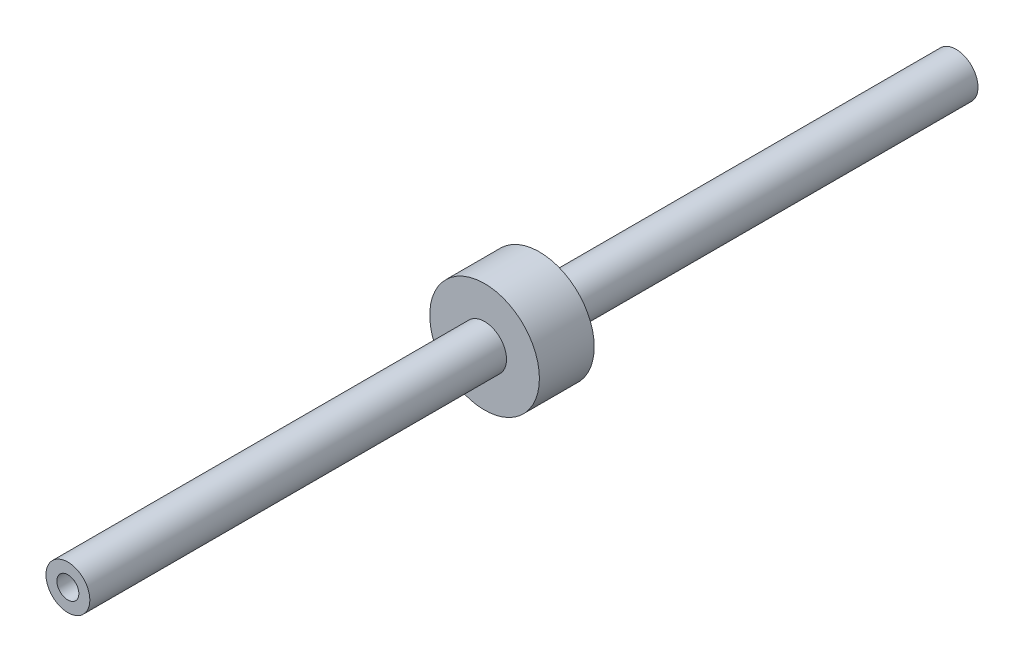
ISO-10303-21;
HEADER;
FILE_DESCRIPTION(('STEP AP214'),'2;1');
FILE_NAME('part.step','',(''),(''),'','','');
FILE_SCHEMA(('AUTOMOTIVE_DESIGN { 1 0 10303 214 1 1 1 1 }'));
ENDSEC;
DATA;
#1=APPLICATION_CONTEXT('core data for automotive mechanical design processes');
#2=APPLICATION_PROTOCOL_DEFINITION('international standard','automotive_design',2000,#1);
#3=PRODUCT_CONTEXT('',#1,'mechanical');
#4=PRODUCT('Part','Part','',(#3));
#5=PRODUCT_RELATED_PRODUCT_CATEGORY('part','',(#4));
#6=PRODUCT_DEFINITION_FORMATION('','',#4);
#7=PRODUCT_DEFINITION_CONTEXT('part definition',#1,'design');
#8=PRODUCT_DEFINITION('design','',#6,#7);
#9=PRODUCT_DEFINITION_SHAPE('','',#8);
#10=(LENGTH_UNIT() NAMED_UNIT(*) SI_UNIT(.MILLI.,.METRE.));
#11=(NAMED_UNIT(*) PLANE_ANGLE_UNIT() SI_UNIT($,.RADIAN.));
#12=(NAMED_UNIT(*) SI_UNIT($,.STERADIAN.) SOLID_ANGLE_UNIT());
#13=UNCERTAINTY_MEASURE_WITH_UNIT(LENGTH_MEASURE(1.E-05),#10,'distance_accuracy_value','');
#14=(GEOMETRIC_REPRESENTATION_CONTEXT(3) GLOBAL_UNCERTAINTY_ASSIGNED_CONTEXT((#13)) GLOBAL_UNIT_ASSIGNED_CONTEXT((#10,
#11,#12)) REPRESENTATION_CONTEXT('',''));
#15=CARTESIAN_POINT('',(0.,0.,0.));
#16=DIRECTION('',(0.,0.,1.));
#17=DIRECTION('',(1.,0.,0.));
#18=AXIS2_PLACEMENT_3D('',#15,#16,#17);
#19=CARTESIAN_POINT('',(0.,0.,38.));
#20=DIRECTION('',(0.,0.,-1.));
#21=DIRECTION('',(-1.,0.,0.));
#22=AXIS2_PLACEMENT_3D('',#19,#20,#21);
#23=CYLINDRICAL_SURFACE('',#22,2.);
#24=CARTESIAN_POINT('',(0.,0.,38.));
#25=DIRECTION('',(0.,0.,1.));
#26=DIRECTION('',(1.,0.,0.));
#27=AXIS2_PLACEMENT_3D('',#24,#25,#26);
#28=CIRCLE('',#27,2.);
#29=CARTESIAN_POINT('',(2.,0.,38.));
#30=VERTEX_POINT('',#29);
#31=EDGE_CURVE('E44',#30,#30,#28,.T.);
#32=ORIENTED_EDGE('',*,*,#31,.F.);
#33=EDGE_LOOP('',(#32));
#34=FACE_BOUND('',#33,.T.);
#35=CARTESIAN_POINT('',(0.,0.,0.));
#36=DIRECTION('',(0.,0.,1.));
#37=DIRECTION('',(1.,0.,0.));
#38=AXIS2_PLACEMENT_3D('',#35,#36,#37);
#39=CIRCLE('',#38,2.);
#40=CARTESIAN_POINT('',(2.,0.,0.));
#41=VERTEX_POINT('',#40);
#42=EDGE_CURVE('E49',#41,#41,#39,.T.);
#43=ORIENTED_EDGE('',*,*,#42,.T.);
#44=EDGE_LOOP('',(#43));
#45=FACE_BOUND('',#44,.T.);
#46=ADVANCED_FACE('F37',(#34,#45),#23,.T.);
#47=CARTESIAN_POINT('',(0.,0.,0.));
#48=DIRECTION('',(0.,0.,1.));
#49=DIRECTION('',(1.,0.,0.));
#50=AXIS2_PLACEMENT_3D('',#47,#48,#49);
#51=PLANE('',#50);
#52=CARTESIAN_POINT('',(0.,0.,0.));
#53=DIRECTION('',(0.,0.,-1.));
#54=DIRECTION('',(-1.,0.,0.));
#55=AXIS2_PLACEMENT_3D('',#52,#53,#54);
#56=CIRCLE('',#55,1.);
#57=CARTESIAN_POINT('',(-1.,0.,0.));
#58=VERTEX_POINT('',#57);
#59=EDGE_CURVE('E116',#58,#58,#56,.T.);
#60=ORIENTED_EDGE('',*,*,#59,.F.);
#61=EDGE_LOOP('',(#60));
#62=FACE_BOUND('',#61,.T.);
#63=ORIENTED_EDGE('',*,*,#42,.F.);
#64=EDGE_LOOP('',(#63));
#65=FACE_BOUND('',#64,.T.);
#66=ADVANCED_FACE('F64',(#62,#65),#51,.F.);
#67=CARTESIAN_POINT('',(0.,0.,43.));
#68=DIRECTION('',(0.,0.,-1.));
#69=DIRECTION('',(-1.,0.,0.));
#70=AXIS2_PLACEMENT_3D('',#67,#68,#69);
#71=CYLINDRICAL_SURFACE('',#70,5.);
#72=CARTESIAN_POINT('',(0.,0.,43.));
#73=DIRECTION('',(0.,0.,1.));
#74=DIRECTION('',(1.,0.,0.));
#75=AXIS2_PLACEMENT_3D('',#72,#73,#74);
#76=CIRCLE('',#75,5.);
#77=CARTESIAN_POINT('',(5.,0.,43.));
#78=VERTEX_POINT('',#77);
#79=EDGE_CURVE('E55',#78,#78,#76,.T.);
#80=ORIENTED_EDGE('',*,*,#79,.F.);
#81=EDGE_LOOP('',(#80));
#82=FACE_BOUND('',#81,.T.);
#83=CARTESIAN_POINT('',(0.,0.,38.));
#84=DIRECTION('',(0.,0.,1.));
#85=DIRECTION('',(1.,0.,0.));
#86=AXIS2_PLACEMENT_3D('',#83,#84,#85);
#87=CIRCLE('',#86,5.);
#88=CARTESIAN_POINT('',(5.,0.,38.));
#89=VERTEX_POINT('',#88);
#90=EDGE_CURVE('E58',#89,#89,#87,.T.);
#91=ORIENTED_EDGE('',*,*,#90,.T.);
#92=EDGE_LOOP('',(#91));
#93=FACE_BOUND('',#92,.T.);
#94=ADVANCED_FACE('F66',(#82,#93),#71,.T.);
#95=CARTESIAN_POINT('',(0.,0.,43.));
#96=DIRECTION('',(0.,0.,1.));
#97=DIRECTION('',(1.,0.,0.));
#98=AXIS2_PLACEMENT_3D('',#95,#96,#97);
#99=PLANE('',#98);
#100=CARTESIAN_POINT('',(0.,0.,43.));
#101=DIRECTION('',(0.,0.,1.));
#102=DIRECTION('',(1.,0.,0.));
#103=AXIS2_PLACEMENT_3D('',#100,#101,#102);
#104=CIRCLE('',#103,2.);
#105=CARTESIAN_POINT('',(2.,0.,43.));
#106=VERTEX_POINT('',#105);
#107=EDGE_CURVE('E10',#106,#106,#104,.T.);
#108=ORIENTED_EDGE('',*,*,#107,.F.);
#109=EDGE_LOOP('',(#108));
#110=FACE_BOUND('',#109,.T.);
#111=ORIENTED_EDGE('',*,*,#79,.T.);
#112=EDGE_LOOP('',(#111));
#113=FACE_BOUND('',#112,.T.);
#114=ADVANCED_FACE('F73',(#110,#113),#99,.T.);
#115=CARTESIAN_POINT('',(0.,0.,38.));
#116=DIRECTION('',(0.,0.,1.));
#117=DIRECTION('',(1.,0.,0.));
#118=AXIS2_PLACEMENT_3D('',#115,#116,#117);
#119=PLANE('',#118);
#120=ORIENTED_EDGE('',*,*,#31,.T.);
#121=EDGE_LOOP('',(#120));
#122=FACE_BOUND('',#121,.T.);
#123=ORIENTED_EDGE('',*,*,#90,.F.);
#124=EDGE_LOOP('',(#123));
#125=FACE_BOUND('',#124,.T.);
#126=ADVANCED_FACE('F80',(#122,#125),#119,.F.);
#127=CARTESIAN_POINT('',(0.,0.,81.));
#128=DIRECTION('',(0.,0.,-1.));
#129=DIRECTION('',(-1.,0.,0.));
#130=AXIS2_PLACEMENT_3D('',#127,#128,#129);
#131=CYLINDRICAL_SURFACE('',#130,2.);
#132=CARTESIAN_POINT('',(0.,0.,81.));
#133=DIRECTION('',(0.,0.,1.));
#134=DIRECTION('',(1.,0.,0.));
#135=AXIS2_PLACEMENT_3D('',#132,#133,#134);
#136=CIRCLE('',#135,2.);
#137=CARTESIAN_POINT('',(2.,0.,81.));
#138=VERTEX_POINT('',#137);
#139=EDGE_CURVE('E53',#138,#138,#136,.T.);
#140=ORIENTED_EDGE('',*,*,#139,.F.);
#141=EDGE_LOOP('',(#140));
#142=FACE_BOUND('',#141,.T.);
#143=ORIENTED_EDGE('',*,*,#107,.T.);
#144=EDGE_LOOP('',(#143));
#145=FACE_BOUND('',#144,.T.);
#146=ADVANCED_FACE('F83',(#142,#145),#131,.T.);
#147=CARTESIAN_POINT('',(0.,0.,81.));
#148=DIRECTION('',(0.,0.,1.));
#149=DIRECTION('',(1.,0.,0.));
#150=AXIS2_PLACEMENT_3D('',#147,#148,#149);
#151=PLANE('',#150);
#152=CARTESIAN_POINT('',(0.,0.,81.));
#153=DIRECTION('',(0.,0.,1.));
#154=DIRECTION('',(1.,0.,0.));
#155=AXIS2_PLACEMENT_3D('',#152,#153,#154);
#156=CIRCLE('',#155,1.);
#157=CARTESIAN_POINT('',(-1.,0.,81.));
#158=VERTEX_POINT('',#157);
#159=EDGE_CURVE('E40',#158,#158,#156,.F.);
#160=ORIENTED_EDGE('',*,*,#159,.T.);
#161=EDGE_LOOP('',(#160));
#162=FACE_BOUND('',#161,.T.);
#163=ORIENTED_EDGE('',*,*,#139,.T.);
#164=EDGE_LOOP('',(#163));
#165=FACE_BOUND('',#164,.T.);
#166=ADVANCED_FACE('F89',(#162,#165),#151,.T.);
#167=CARTESIAN_POINT('',(0.,0.,5.));
#168=DIRECTION('',(0.,0.,-1.));
#169=DIRECTION('',(-1.,0.,0.));
#170=AXIS2_PLACEMENT_3D('',#167,#168,#169);
#171=CYLINDRICAL_SURFACE('',#170,1.);
#172=CARTESIAN_POINT('',(0.,0.,5.));
#173=DIRECTION('',(0.,0.,-1.));
#174=DIRECTION('',(-1.,0.,0.));
#175=AXIS2_PLACEMENT_3D('',#172,#173,#174);
#176=CIRCLE('',#175,1.);
#177=CARTESIAN_POINT('',(-1.,0.,5.));
#178=VERTEX_POINT('',#177);
#179=EDGE_CURVE('E118',#178,#178,#176,.T.);
#180=ORIENTED_EDGE('',*,*,#179,.F.);
#181=EDGE_LOOP('',(#180));
#182=FACE_BOUND('',#181,.T.);
#183=ORIENTED_EDGE('',*,*,#59,.T.);
#184=EDGE_LOOP('',(#183));
#185=FACE_BOUND('',#184,.T.);
#186=ADVANCED_FACE('F93',(#182,#185),#171,.F.);
#187=CARTESIAN_POINT('',(0.,0.,5.));
#188=DIRECTION('',(0.,0.,-1.));
#189=DIRECTION('',(-1.,0.,0.));
#190=AXIS2_PLACEMENT_3D('',#187,#188,#189);
#191=PLANE('',#190);
#192=ORIENTED_EDGE('',*,*,#179,.T.);
#193=EDGE_LOOP('',(#192));
#194=FACE_BOUND('',#193,.T.);
#195=ADVANCED_FACE('F96',(#194),#191,.T.);
#196=CARTESIAN_POINT('',(0.,0.,81.000012));
#197=DIRECTION('',(0.,0.,-1.));
#198=DIRECTION('',(-1.,0.,0.));
#199=AXIS2_PLACEMENT_3D('',#196,#197,#198);
#200=CYLINDRICAL_SURFACE('',#199,1.);
#201=CARTESIAN_POINT('',(0.,0.,76.));
#202=DIRECTION('',(0.,0.,1.));
#203=DIRECTION('',(1.,0.,0.));
#204=AXIS2_PLACEMENT_3D('',#201,#202,#203);
#205=CIRCLE('',#204,1.);
#206=CARTESIAN_POINT('',(-1.,0.,76.));
#207=VERTEX_POINT('',#206);
#208=EDGE_CURVE('E112',#207,#207,#205,.T.);
#209=CARTESIAN_POINT('',(-1.,0.,81.));
#210=CARTESIAN_POINT('',(-1.,0.,80.9479166666666));
#211=CARTESIAN_POINT('',(-1.,0.,80.8958333333333));
#212=CARTESIAN_POINT('',(-1.,0.,80.7916666666667));
#213=CARTESIAN_POINT('',(-1.,0.,80.7395833333333));
#214=CARTESIAN_POINT('',(-1.,0.,80.6354166666667));
#215=CARTESIAN_POINT('',(-1.,0.,80.5833333333333));
#216=CARTESIAN_POINT('',(-1.,0.,80.4791666666666));
#217=CARTESIAN_POINT('',(-1.,0.,80.4270833333333));
#218=CARTESIAN_POINT('',(-1.,0.,80.3229166666666));
#219=CARTESIAN_POINT('',(-1.,0.,80.2708333333333));
#220=CARTESIAN_POINT('',(-1.,0.,80.1666666666666));
#221=CARTESIAN_POINT('',(-1.,0.,80.1145833333333));
#222=CARTESIAN_POINT('',(-1.,0.,80.0104166666667));
#223=CARTESIAN_POINT('',(-1.,0.,79.9583333333333));
#224=CARTESIAN_POINT('',(-1.,0.,79.8541666666666));
#225=CARTESIAN_POINT('',(-1.,0.,79.8020833333333));
#226=CARTESIAN_POINT('',(-1.,0.,79.6979166666666));
#227=CARTESIAN_POINT('',(-1.,0.,79.6458333333333));
#228=CARTESIAN_POINT('',(-1.,0.,79.5416666666666));
#229=CARTESIAN_POINT('',(-1.,0.,79.4895833333333));
#230=CARTESIAN_POINT('',(-1.,0.,79.3854166666667));
#231=CARTESIAN_POINT('',(-1.,0.,79.3333333333333));
#232=CARTESIAN_POINT('',(-1.,0.,79.2291666666666));
#233=CARTESIAN_POINT('',(-1.,0.,79.1770833333333));
#234=CARTESIAN_POINT('',(-1.,0.,79.0729166666666));
#235=CARTESIAN_POINT('',(-1.,0.,79.0208333333333));
#236=CARTESIAN_POINT('',(-1.,0.,78.9166666666666));
#237=CARTESIAN_POINT('',(-1.,0.,78.8645833333333));
#238=CARTESIAN_POINT('',(-1.,0.,78.7604166666667));
#239=CARTESIAN_POINT('',(-1.,0.,78.7083333333333));
#240=CARTESIAN_POINT('',(-1.,0.,78.6041666666666));
#241=CARTESIAN_POINT('',(-1.,0.,78.5520833333333));
#242=CARTESIAN_POINT('',(-1.,0.,78.4479166666666));
#243=CARTESIAN_POINT('',(-1.,0.,78.3958333333333));
#244=CARTESIAN_POINT('',(-1.,0.,78.2916666666666));
#245=CARTESIAN_POINT('',(-1.,0.,78.2395833333333));
#246=CARTESIAN_POINT('',(-1.,0.,78.1354166666667));
#247=CARTESIAN_POINT('',(-1.,0.,78.0833333333333));
#248=CARTESIAN_POINT('',(-1.,0.,77.9791666666666));
#249=CARTESIAN_POINT('',(-1.,0.,77.9270833333333));
#250=CARTESIAN_POINT('',(-1.,0.,77.8229166666666));
#251=CARTESIAN_POINT('',(-1.,0.,77.7708333333333));
#252=CARTESIAN_POINT('',(-1.,0.,77.6666666666666));
#253=CARTESIAN_POINT('',(-1.,0.,77.6145833333333));
#254=CARTESIAN_POINT('',(-1.,0.,77.5104166666667));
#255=CARTESIAN_POINT('',(-1.,0.,77.4583333333333));
#256=CARTESIAN_POINT('',(-1.,0.,77.3541666666666));
#257=CARTESIAN_POINT('',(-1.,0.,77.3020833333333));
#258=CARTESIAN_POINT('',(-1.,0.,77.1979166666666));
#259=CARTESIAN_POINT('',(-1.,0.,77.1458333333333));
#260=CARTESIAN_POINT('',(-1.,0.,77.0416666666666));
#261=CARTESIAN_POINT('',(-1.,0.,76.9895833333333));
#262=CARTESIAN_POINT('',(-1.,0.,76.8854166666667));
#263=CARTESIAN_POINT('',(-1.,0.,76.8333333333333));
#264=CARTESIAN_POINT('',(-1.,0.,76.7291666666666));
#265=CARTESIAN_POINT('',(-1.,0.,76.6770833333333));
#266=CARTESIAN_POINT('',(-1.,0.,76.5729166666666));
#267=CARTESIAN_POINT('',(-1.,0.,76.5208333333333));
#268=CARTESIAN_POINT('',(-1.,0.,76.4166666666666));
#269=CARTESIAN_POINT('',(-1.,0.,76.3645833333333));
#270=CARTESIAN_POINT('',(-1.,0.,76.2604166666666));
#271=CARTESIAN_POINT('',(-1.,0.,76.2083333333333));
#272=CARTESIAN_POINT('',(-1.,0.,76.1041666666666));
#273=CARTESIAN_POINT('',(-1.,0.,76.0520833333333));
#274=CARTESIAN_POINT('',(-1.,0.,76.));
#275=B_SPLINE_CURVE_WITH_KNOTS('',3,(#209,#210,#211,#212,#213,#214,#215,#216,#217,#218,#219,
#220,#221,#222,#223,#224,#225,#226,#227,#228,#229,#230,#231,#232,#233,#234,#235,#236,#237,#238,
#239,#240,#241,#242,#243,#244,#245,#246,#247,#248,#249,#250,#251,#252,#253,#254,#255,#256,#257,
#258,#259,#260,#261,#262,#263,#264,#265,#266,#267,#268,#269,#270,#271,#272,#273,#274),
.UNSPECIFIED.,.F.,.F.,(4,2,2,2,2,2,2,2,2,2,2,2,2,2,2,2,2,2,2,2,2,2,2,2,2,2,2,2,2,2,2,2,4),(0.,
0.156249999999997,0.312499999999993,0.46874999999999,0.625000000000001,0.781249999999997,
0.937499999999994,1.09374999999999,1.25,1.40625,1.56249999999999,1.71874999999999,1.875,2.03125,
2.1875,2.34374999999999,2.5,2.65625,2.8125,2.96874999999999,3.125,3.28125,3.4375,
3.59374999999999,3.75,3.90625,4.0625,4.21874999999999,4.375,4.53125,4.6875,4.84374999999999,5.),.UNSPECIFIED.);
#276=EDGE_CURVE('BSEAM100',#158,#207,#275,.T.);
#277=ORIENTED_EDGE('',*,*,#159,.F.);
#278=ORIENTED_EDGE('',*,*,#208,.F.);
#279=ORIENTED_EDGE('',*,*,#276,.T.);
#280=ORIENTED_EDGE('',*,*,#276,.F.);
#281=EDGE_LOOP('',(#277,#279,#278,#280));
#282=FACE_BOUND('',#281,.T.);
#283=ADVANCED_FACE('F100',(#282),#200,.F.);
#284=CARTESIAN_POINT('',(0.,0.,76.));
#285=DIRECTION('',(0.,0.,1.));
#286=DIRECTION('',(1.,0.,0.));
#287=AXIS2_PLACEMENT_3D('',#284,#285,#286);
#288=PLANE('',#287);
#289=ORIENTED_EDGE('',*,*,#208,.T.);
#290=EDGE_LOOP('',(#289));
#291=FACE_BOUND('',#290,.T.);
#292=ADVANCED_FACE('F104',(#291),#288,.T.);
#293=CLOSED_SHELL('',(#46,#66,#94,#114,#126,#146,#166,#186,#195,#283,#292));
#294=MANIFOLD_SOLID_BREP('B2',#293);
#295=ADVANCED_BREP_SHAPE_REPRESENTATION('',(#18,#294),#14);
#296=SHAPE_DEFINITION_REPRESENTATION(#9,#295);
ENDSEC;
END-ISO-10303-21;
